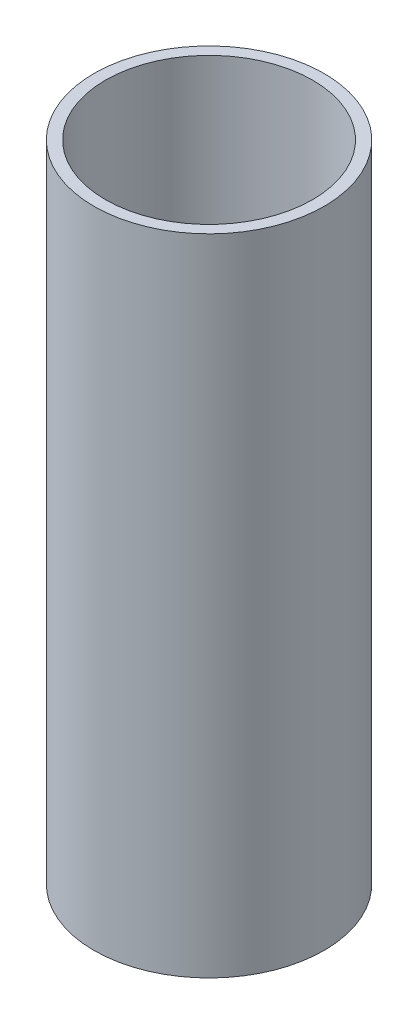
ISO-10303-21;
HEADER;
FILE_DESCRIPTION(('STEP AP214'),'2;1');
FILE_NAME('part.step','',(''),(''),'','','');
FILE_SCHEMA(('AUTOMOTIVE_DESIGN { 1 0 10303 214 1 1 1 1 }'));
ENDSEC;
DATA;
#1=APPLICATION_CONTEXT('core data for automotive mechanical design processes');
#2=APPLICATION_PROTOCOL_DEFINITION('international standard','automotive_design',2000,#1);
#3=PRODUCT_CONTEXT('',#1,'mechanical');
#4=PRODUCT('Part','Part','',(#3));
#5=PRODUCT_RELATED_PRODUCT_CATEGORY('part','',(#4));
#6=PRODUCT_DEFINITION_FORMATION('','',#4);
#7=PRODUCT_DEFINITION_CONTEXT('part definition',#1,'design');
#8=PRODUCT_DEFINITION('design','',#6,#7);
#9=PRODUCT_DEFINITION_SHAPE('','',#8);
#10=(LENGTH_UNIT() NAMED_UNIT(*) SI_UNIT(.MILLI.,.METRE.));
#11=(NAMED_UNIT(*) PLANE_ANGLE_UNIT() SI_UNIT($,.RADIAN.));
#12=(NAMED_UNIT(*) SI_UNIT($,.STERADIAN.) SOLID_ANGLE_UNIT());
#13=UNCERTAINTY_MEASURE_WITH_UNIT(LENGTH_MEASURE(1.E-05),#10,'distance_accuracy_value','');
#14=(GEOMETRIC_REPRESENTATION_CONTEXT(3) GLOBAL_UNCERTAINTY_ASSIGNED_CONTEXT((#13)) GLOBAL_UNIT_ASSIGNED_CONTEXT((#10,
#11,#12)) REPRESENTATION_CONTEXT('',''));
#15=CARTESIAN_POINT('',(0.,0.,0.));
#16=DIRECTION('',(0.,0.,1.));
#17=DIRECTION('',(1.,0.,0.));
#18=AXIS2_PLACEMENT_3D('',#15,#16,#17);
#19=CARTESIAN_POINT('',(0.,14.,0.));
#20=DIRECTION('',(0.,1.,0.));
#21=DIRECTION('',(0.,0.,1.));
#22=AXIS2_PLACEMENT_3D('',#19,#20,#21);
#23=PLANE('',#22);
#24=CARTESIAN_POINT('',(0.,14.,0.));
#25=DIRECTION('',(0.,1.,0.));
#26=DIRECTION('',(0.,0.,1.));
#27=AXIS2_PLACEMENT_3D('',#24,#25,#26);
#28=CIRCLE('',#27,5.);
#29=CARTESIAN_POINT('',(0.,14.,5.));
#30=VERTEX_POINT('',#29);
#31=EDGE_CURVE('E10',#30,#30,#28,.T.);
#32=ORIENTED_EDGE('',*,*,#31,.T.);
#33=EDGE_LOOP('',(#32));
#34=FACE_BOUND('',#33,.T.);
#35=CARTESIAN_POINT('',(0.,14.,0.));
#36=DIRECTION('',(0.,1.,0.));
#37=DIRECTION('',(0.,0.,1.));
#38=AXIS2_PLACEMENT_3D('',#35,#36,#37);
#39=CIRCLE('',#38,4.5);
#40=CARTESIAN_POINT('',(0.,14.,4.5));
#41=VERTEX_POINT('',#40);
#42=EDGE_CURVE('E49',#41,#41,#39,.T.);
#43=ORIENTED_EDGE('',*,*,#42,.F.);
#44=EDGE_LOOP('',(#43));
#45=FACE_BOUND('',#44,.T.);
#46=ADVANCED_FACE('F36',(#34,#45),#23,.T.);
#47=CARTESIAN_POINT('',(0.,-14.,0.));
#48=DIRECTION('',(0.,1.,0.));
#49=DIRECTION('',(0.,0.,1.));
#50=AXIS2_PLACEMENT_3D('',#47,#48,#49);
#51=PLANE('',#50);
#52=CARTESIAN_POINT('',(0.,-14.,0.));
#53=DIRECTION('',(0.,1.,0.));
#54=DIRECTION('',(0.,0.,1.));
#55=AXIS2_PLACEMENT_3D('',#52,#53,#54);
#56=CIRCLE('',#55,5.);
#57=CARTESIAN_POINT('',(0.,-14.,5.));
#58=VERTEX_POINT('',#57);
#59=EDGE_CURVE('E40',#58,#58,#56,.T.);
#60=ORIENTED_EDGE('',*,*,#59,.F.);
#61=EDGE_LOOP('',(#60));
#62=FACE_BOUND('',#61,.T.);
#63=CARTESIAN_POINT('',(0.,-14.,0.));
#64=DIRECTION('',(0.,1.,0.));
#65=DIRECTION('',(0.,0.,1.));
#66=AXIS2_PLACEMENT_3D('',#63,#64,#65);
#67=CIRCLE('',#66,4.5);
#68=CARTESIAN_POINT('',(0.,-14.,4.5));
#69=VERTEX_POINT('',#68);
#70=EDGE_CURVE('E51',#69,#69,#67,.T.);
#71=ORIENTED_EDGE('',*,*,#70,.T.);
#72=EDGE_LOOP('',(#71));
#73=FACE_BOUND('',#72,.T.);
#74=ADVANCED_FACE('F61',(#62,#73),#51,.F.);
#75=CARTESIAN_POINT('',(0.,14.,0.));
#76=DIRECTION('',(0.,-1.,0.));
#77=DIRECTION('',(0.,0.,-1.));
#78=AXIS2_PLACEMENT_3D('',#75,#76,#77);
#79=CYLINDRICAL_SURFACE('',#78,5.);
#80=ORIENTED_EDGE('',*,*,#31,.F.);
#81=EDGE_LOOP('',(#80));
#82=FACE_BOUND('',#81,.T.);
#83=ORIENTED_EDGE('',*,*,#59,.T.);
#84=EDGE_LOOP('',(#83));
#85=FACE_BOUND('',#84,.T.);
#86=ADVANCED_FACE('F38',(#82,#85),#79,.T.);
#87=CARTESIAN_POINT('',(0.,14.,0.));
#88=DIRECTION('',(0.,-1.,0.));
#89=DIRECTION('',(0.,0.,-1.));
#90=AXIS2_PLACEMENT_3D('',#87,#88,#89);
#91=CYLINDRICAL_SURFACE('',#90,4.5);
#92=ORIENTED_EDGE('',*,*,#42,.T.);
#93=EDGE_LOOP('',(#92));
#94=FACE_BOUND('',#93,.T.);
#95=ORIENTED_EDGE('',*,*,#70,.F.);
#96=EDGE_LOOP('',(#95));
#97=FACE_BOUND('',#96,.T.);
#98=ADVANCED_FACE('F57',(#94,#97),#91,.F.);
#99=CLOSED_SHELL('',(#46,#74,#86,#98));
#100=MANIFOLD_SOLID_BREP('B2',#99);
#101=ADVANCED_BREP_SHAPE_REPRESENTATION('',(#18,#100),#14);
#102=SHAPE_DEFINITION_REPRESENTATION(#9,#101);
ENDSEC;
END-ISO-10303-21;
